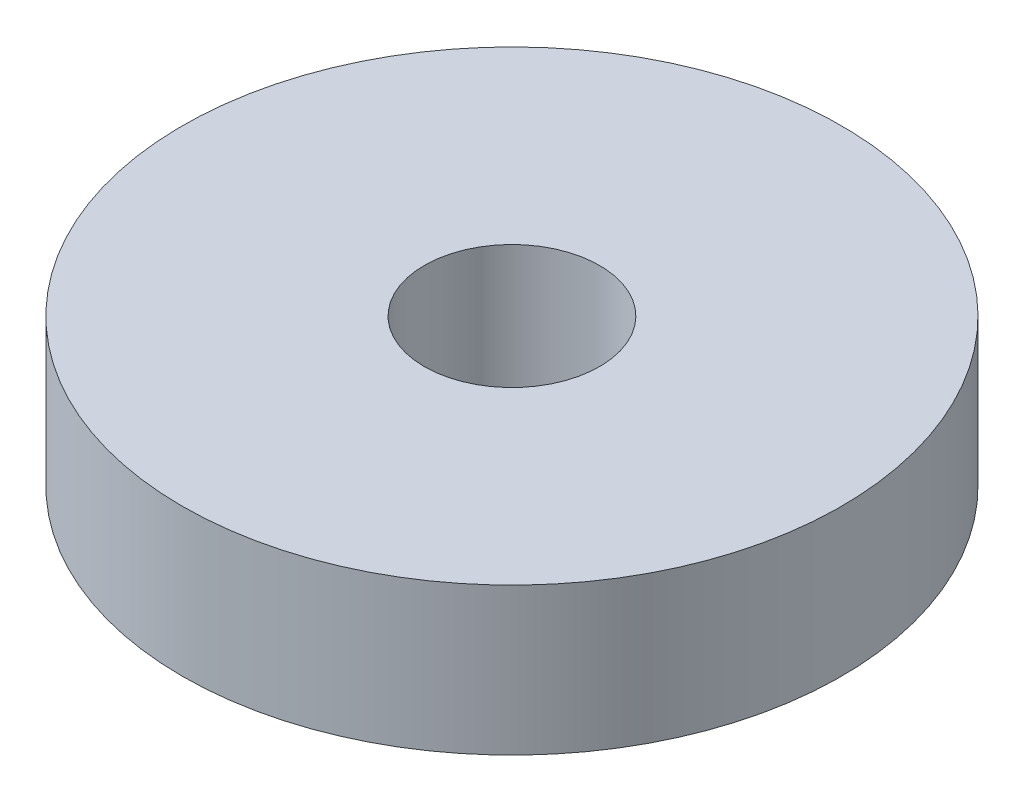
ISO-10303-21;
HEADER;
FILE_DESCRIPTION(('STEP AP214'),'2;1');
FILE_NAME('part.step','',(''),(''),'','','');
FILE_SCHEMA(('AUTOMOTIVE_DESIGN { 1 0 10303 214 1 1 1 1 }'));
ENDSEC;
DATA;
#1=APPLICATION_CONTEXT('core data for automotive mechanical design processes');
#2=APPLICATION_PROTOCOL_DEFINITION('international standard','automotive_design',2000,#1);
#3=PRODUCT_CONTEXT('',#1,'mechanical');
#4=PRODUCT('Part','Part','',(#3));
#5=PRODUCT_RELATED_PRODUCT_CATEGORY('part','',(#4));
#6=PRODUCT_DEFINITION_FORMATION('','',#4);
#7=PRODUCT_DEFINITION_CONTEXT('part definition',#1,'design');
#8=PRODUCT_DEFINITION('design','',#6,#7);
#9=PRODUCT_DEFINITION_SHAPE('','',#8);
#10=(LENGTH_UNIT() NAMED_UNIT(*) SI_UNIT(.MILLI.,.METRE.));
#11=(NAMED_UNIT(*) PLANE_ANGLE_UNIT() SI_UNIT($,.RADIAN.));
#12=(NAMED_UNIT(*) SI_UNIT($,.STERADIAN.) SOLID_ANGLE_UNIT());
#13=UNCERTAINTY_MEASURE_WITH_UNIT(LENGTH_MEASURE(1.E-05),#10,'distance_accuracy_value','');
#14=(GEOMETRIC_REPRESENTATION_CONTEXT(3) GLOBAL_UNCERTAINTY_ASSIGNED_CONTEXT((#13)) GLOBAL_UNIT_ASSIGNED_CONTEXT((#10,
#11,#12)) REPRESENTATION_CONTEXT('',''));
#15=CARTESIAN_POINT('',(0.,0.,0.));
#16=DIRECTION('',(0.,0.,1.));
#17=DIRECTION('',(1.,0.,0.));
#18=AXIS2_PLACEMENT_3D('',#15,#16,#17);
#19=CARTESIAN_POINT('',(0.,4.2,0.));
#20=DIRECTION('',(0.,1.,0.));
#21=DIRECTION('',(0.,0.,1.));
#22=AXIS2_PLACEMENT_3D('',#19,#20,#21);
#23=PLANE('',#22);
#24=CARTESIAN_POINT('',(0.,4.2,0.));
#25=DIRECTION('',(0.,1.,0.));
#26=DIRECTION('',(0.,0.,1.));
#27=AXIS2_PLACEMENT_3D('',#24,#25,#26);
#28=CIRCLE('',#27,9.4);
#29=CARTESIAN_POINT('',(0.,4.2,9.4));
#30=VERTEX_POINT('',#29);
#31=EDGE_CURVE('E12',#30,#30,#28,.T.);
#32=ORIENTED_EDGE('',*,*,#31,.T.);
#33=EDGE_LOOP('',(#32));
#34=FACE_BOUND('',#33,.T.);
#35=CARTESIAN_POINT('',(0.,4.2,0.));
#36=DIRECTION('',(0.,1.,0.));
#37=DIRECTION('',(0.,0.,1.));
#38=AXIS2_PLACEMENT_3D('',#35,#36,#37);
#39=CIRCLE('',#38,2.5);
#40=CARTESIAN_POINT('',(0.,4.2,2.5));
#41=VERTEX_POINT('',#40);
#42=EDGE_CURVE('E53',#41,#41,#39,.T.);
#43=ORIENTED_EDGE('',*,*,#42,.F.);
#44=EDGE_LOOP('',(#43));
#45=FACE_BOUND('',#44,.T.);
#46=ADVANCED_FACE('F42',(#34,#45),#23,.T.);
#47=CARTESIAN_POINT('',(0.,0.,0.));
#48=DIRECTION('',(0.,1.,0.));
#49=DIRECTION('',(0.,0.,1.));
#50=AXIS2_PLACEMENT_3D('',#47,#48,#49);
#51=PLANE('',#50);
#52=CARTESIAN_POINT('',(0.,0.,0.));
#53=DIRECTION('',(0.,1.,0.));
#54=DIRECTION('',(0.,0.,1.));
#55=AXIS2_PLACEMENT_3D('',#52,#53,#54);
#56=CIRCLE('',#55,9.4);
#57=CARTESIAN_POINT('',(0.,0.,9.4));
#58=VERTEX_POINT('',#57);
#59=EDGE_CURVE('E46',#58,#58,#56,.T.);
#60=ORIENTED_EDGE('',*,*,#59,.F.);
#61=EDGE_LOOP('',(#60));
#62=FACE_BOUND('',#61,.T.);
#63=CARTESIAN_POINT('',(0.,0.,0.));
#64=DIRECTION('',(0.,1.,0.));
#65=DIRECTION('',(0.,0.,1.));
#66=AXIS2_PLACEMENT_3D('',#63,#64,#65);
#67=CIRCLE('',#66,2.5);
#68=CARTESIAN_POINT('',(0.,0.,2.5));
#69=VERTEX_POINT('',#68);
#70=EDGE_CURVE('E55',#69,#69,#67,.T.);
#71=ORIENTED_EDGE('',*,*,#70,.T.);
#72=EDGE_LOOP('',(#71));
#73=FACE_BOUND('',#72,.T.);
#74=ADVANCED_FACE('F65',(#62,#73),#51,.F.);
#75=CARTESIAN_POINT('',(0.,4.2,0.));
#76=DIRECTION('',(0.,-1.,0.));
#77=DIRECTION('',(0.,0.,-1.));
#78=AXIS2_PLACEMENT_3D('',#75,#76,#77);
#79=CYLINDRICAL_SURFACE('',#78,9.4);
#80=ORIENTED_EDGE('',*,*,#31,.F.);
#81=EDGE_LOOP('',(#80));
#82=FACE_BOUND('',#81,.T.);
#83=ORIENTED_EDGE('',*,*,#59,.T.);
#84=EDGE_LOOP('',(#83));
#85=FACE_BOUND('',#84,.T.);
#86=ADVANCED_FACE('F44',(#82,#85),#79,.T.);
#87=CARTESIAN_POINT('',(0.,4.2,0.));
#88=DIRECTION('',(0.,-1.,0.));
#89=DIRECTION('',(0.,0.,-1.));
#90=AXIS2_PLACEMENT_3D('',#87,#88,#89);
#91=CYLINDRICAL_SURFACE('',#90,2.5);
#92=ORIENTED_EDGE('',*,*,#42,.T.);
#93=EDGE_LOOP('',(#92));
#94=FACE_BOUND('',#93,.T.);
#95=ORIENTED_EDGE('',*,*,#70,.F.);
#96=EDGE_LOOP('',(#95));
#97=FACE_BOUND('',#96,.T.);
#98=ADVANCED_FACE('F61',(#94,#97),#91,.F.);
#99=CLOSED_SHELL('',(#46,#74,#86,#98));
#100=MANIFOLD_SOLID_BREP('B2',#99);
#101=ADVANCED_BREP_SHAPE_REPRESENTATION('',(#18,#100),#14);
#102=SHAPE_DEFINITION_REPRESENTATION(#9,#101);
ENDSEC;
END-ISO-10303-21;
